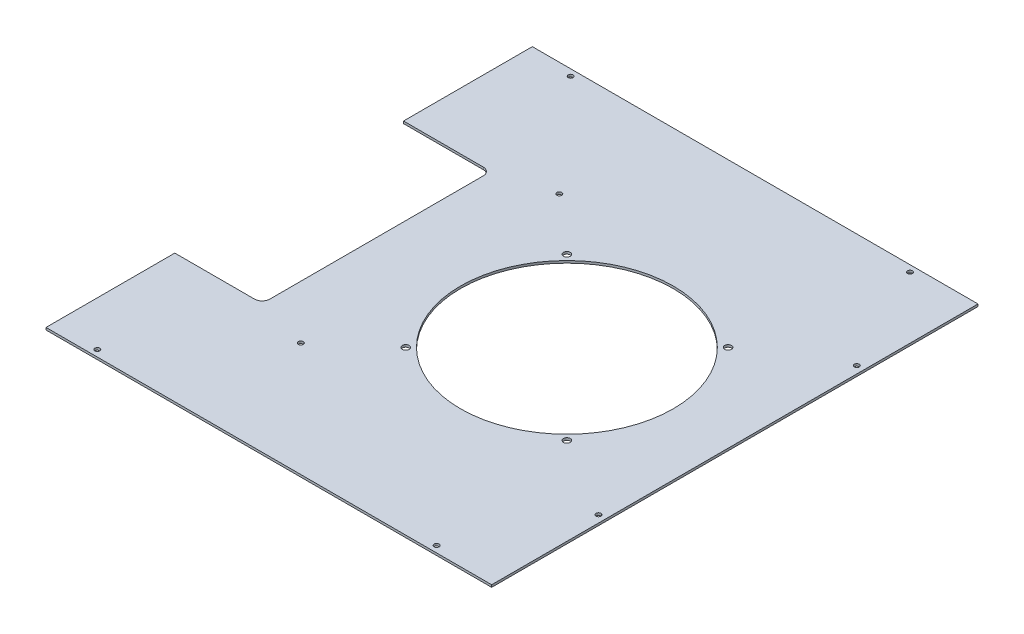
ISO-10303-21;
HEADER;
FILE_DESCRIPTION(('STEP AP214'),'2;1');
FILE_NAME('part.step','',(''),(''),'','','');
FILE_SCHEMA(('AUTOMOTIVE_DESIGN { 1 0 10303 214 1 1 1 1 }'));
ENDSEC;
DATA;
#1=APPLICATION_CONTEXT('core data for automotive mechanical design processes');
#2=APPLICATION_PROTOCOL_DEFINITION('international standard','automotive_design',2000,#1);
#3=PRODUCT_CONTEXT('',#1,'mechanical');
#4=PRODUCT('Part','Part','',(#3));
#5=PRODUCT_RELATED_PRODUCT_CATEGORY('part','',(#4));
#6=PRODUCT_DEFINITION_FORMATION('','',#4);
#7=PRODUCT_DEFINITION_CONTEXT('part definition',#1,'design');
#8=PRODUCT_DEFINITION('design','',#6,#7);
#9=PRODUCT_DEFINITION_SHAPE('','',#8);
#10=(LENGTH_UNIT() NAMED_UNIT(*) SI_UNIT(.MILLI.,.METRE.));
#11=(NAMED_UNIT(*) PLANE_ANGLE_UNIT() SI_UNIT($,.RADIAN.));
#12=(NAMED_UNIT(*) SI_UNIT($,.STERADIAN.) SOLID_ANGLE_UNIT());
#13=UNCERTAINTY_MEASURE_WITH_UNIT(LENGTH_MEASURE(1.E-05),#10,'distance_accuracy_value','');
#14=(GEOMETRIC_REPRESENTATION_CONTEXT(3) GLOBAL_UNCERTAINTY_ASSIGNED_CONTEXT((#13)) GLOBAL_UNIT_ASSIGNED_CONTEXT((#10,
#11,#12)) REPRESENTATION_CONTEXT('',''));
#15=CARTESIAN_POINT('',(0.,0.,0.));
#16=DIRECTION('',(0.,0.,1.));
#17=DIRECTION('',(1.,0.,0.));
#18=AXIS2_PLACEMENT_3D('',#15,#16,#17);
#19=CARTESIAN_POINT('',(0.,3.,0.));
#20=DIRECTION('',(1.,0.,0.));
#21=DIRECTION('',(0.,0.,-1.));
#22=AXIS2_PLACEMENT_3D('',#19,#20,#21);
#23=PLANE('',#22);
#24=DIRECTION('',(0.,0.,1.));
#25=VECTOR('',#24,1.);
#26=CARTESIAN_POINT('',(0.,0.,0.));
#27=LINE('',#26,#25);
#28=CARTESIAN_POINT('',(0.,0.,-640.));
#29=VERTEX_POINT('',#28);
#30=CARTESIAN_POINT('',(0.,0.,-470.5));
#31=VERTEX_POINT('',#30);
#32=EDGE_CURVE('E149',#29,#31,#27,.T.);
#33=ORIENTED_EDGE('',*,*,#32,.T.);
#34=DIRECTION('',(0.,1.,0.));
#35=VECTOR('',#34,1.);
#36=CARTESIAN_POINT('',(0.,0.,-470.5));
#37=LINE('',#36,#35);
#38=CARTESIAN_POINT('',(0.,3.,-470.5));
#39=VERTEX_POINT('',#38);
#40=EDGE_CURVE('E150',#31,#39,#37,.T.);
#41=ORIENTED_EDGE('',*,*,#40,.T.);
#42=DIRECTION('',(0.,0.,1.));
#43=VECTOR('',#42,1.);
#44=CARTESIAN_POINT('',(0.,3.,0.));
#45=LINE('',#44,#43);
#46=CARTESIAN_POINT('',(0.,3.,-640.));
#47=VERTEX_POINT('',#46);
#48=EDGE_CURVE('E179',#47,#39,#45,.T.);
#49=ORIENTED_EDGE('',*,*,#48,.F.);
#50=DIRECTION('',(0.,-1.,0.));
#51=VECTOR('',#50,1.);
#52=CARTESIAN_POINT('',(0.,3.,-640.));
#53=LINE('',#52,#51);
#54=EDGE_CURVE('E163',#47,#29,#53,.T.);
#55=ORIENTED_EDGE('',*,*,#54,.T.);
#56=EDGE_LOOP('',(#33,#41,#49,#55));
#57=FACE_BOUND('',#56,.T.);
#58=ADVANCED_FACE('F43',(#57),#23,.F.);
#59=CARTESIAN_POINT('',(0.,3.,-169.5));
#60=VERTEX_POINT('',#59);
#61=CARTESIAN_POINT('',(0.,3.,0.));
#62=VERTEX_POINT('',#61);
#63=EDGE_CURVE('E95',#60,#62,#45,.T.);
#64=ORIENTED_EDGE('',*,*,#63,.F.);
#65=DIRECTION('',(0.,1.,0.));
#66=VECTOR('',#65,1.);
#67=CARTESIAN_POINT('',(0.,0.,-169.5));
#68=LINE('',#67,#66);
#69=CARTESIAN_POINT('',(0.,0.,-169.5));
#70=VERTEX_POINT('',#69);
#71=EDGE_CURVE('E133',#70,#60,#68,.T.);
#72=ORIENTED_EDGE('',*,*,#71,.F.);
#73=CARTESIAN_POINT('',(0.,0.,0.));
#74=VERTEX_POINT('',#73);
#75=EDGE_CURVE('E141',#70,#74,#27,.T.);
#76=ORIENTED_EDGE('',*,*,#75,.T.);
#77=DIRECTION('',(0.,-1.,0.));
#78=VECTOR('',#77,1.);
#79=CARTESIAN_POINT('',(0.,3.,0.));
#80=LINE('',#79,#78);
#81=EDGE_CURVE('E11',#62,#74,#80,.T.);
#82=ORIENTED_EDGE('',*,*,#81,.F.);
#83=EDGE_LOOP('',(#64,#72,#76,#82));
#84=FACE_BOUND('',#83,.T.);
#85=ADVANCED_FACE('F45',(#84),#23,.F.);
#86=CARTESIAN_POINT('',(0.,3.,0.));
#87=DIRECTION('',(0.,0.,-1.));
#88=DIRECTION('',(-1.,0.,0.));
#89=AXIS2_PLACEMENT_3D('',#86,#87,#88);
#90=PLANE('',#89);
#91=DIRECTION('',(1.,0.,0.));
#92=VECTOR('',#91,1.);
#93=CARTESIAN_POINT('',(0.,0.,0.));
#94=LINE('',#93,#92);
#95=CARTESIAN_POINT('',(586.5,0.,0.));
#96=VERTEX_POINT('',#95);
#97=EDGE_CURVE('E148',#74,#96,#94,.T.);
#98=ORIENTED_EDGE('',*,*,#97,.T.);
#99=DIRECTION('',(0.,-1.,0.));
#100=VECTOR('',#99,1.);
#101=CARTESIAN_POINT('',(586.5,3.,0.));
#102=LINE('',#101,#100);
#103=CARTESIAN_POINT('',(586.5,3.,0.));
#104=VERTEX_POINT('',#103);
#105=EDGE_CURVE('E51',#104,#96,#102,.T.);
#106=ORIENTED_EDGE('',*,*,#105,.F.);
#107=DIRECTION('',(1.,0.,0.));
#108=VECTOR('',#107,1.);
#109=CARTESIAN_POINT('',(0.,3.,0.));
#110=LINE('',#109,#108);
#111=EDGE_CURVE('E181',#62,#104,#110,.T.);
#112=ORIENTED_EDGE('',*,*,#111,.F.);
#113=ORIENTED_EDGE('',*,*,#81,.T.);
#114=EDGE_LOOP('',(#98,#106,#112,#113));
#115=FACE_BOUND('',#114,.T.);
#116=ADVANCED_FACE('F338',(#115),#90,.F.);
#117=CARTESIAN_POINT('',(586.5,3.,0.));
#118=DIRECTION('',(-1.,0.,0.));
#119=DIRECTION('',(0.,0.,1.));
#120=AXIS2_PLACEMENT_3D('',#117,#118,#119);
#121=PLANE('',#120);
#122=DIRECTION('',(0.,0.,-1.));
#123=VECTOR('',#122,1.);
#124=CARTESIAN_POINT('',(586.5,0.,0.));
#125=LINE('',#124,#123);
#126=CARTESIAN_POINT('',(586.5,0.,-640.));
#127=VERTEX_POINT('',#126);
#128=EDGE_CURVE('E160',#96,#127,#125,.T.);
#129=ORIENTED_EDGE('',*,*,#128,.T.);
#130=DIRECTION('',(0.,-1.,0.));
#131=VECTOR('',#130,1.);
#132=CARTESIAN_POINT('',(586.5,3.,-640.));
#133=LINE('',#132,#131);
#134=CARTESIAN_POINT('',(586.5,3.,-640.));
#135=VERTEX_POINT('',#134);
#136=EDGE_CURVE('E165',#135,#127,#133,.T.);
#137=ORIENTED_EDGE('',*,*,#136,.F.);
#138=DIRECTION('',(0.,0.,-1.));
#139=VECTOR('',#138,1.);
#140=CARTESIAN_POINT('',(586.5,3.,0.));
#141=LINE('',#140,#139);
#142=EDGE_CURVE('E172',#104,#135,#141,.T.);
#143=ORIENTED_EDGE('',*,*,#142,.F.);
#144=ORIENTED_EDGE('',*,*,#105,.T.);
#145=EDGE_LOOP('',(#129,#137,#143,#144));
#146=FACE_BOUND('',#145,.T.);
#147=ADVANCED_FACE('F170',(#146),#121,.F.);
#148=CARTESIAN_POINT('',(0.,3.,-640.));
#149=DIRECTION('',(0.,0.,1.));
#150=DIRECTION('',(1.,0.,0.));
#151=AXIS2_PLACEMENT_3D('',#148,#149,#150);
#152=PLANE('',#151);
#153=DIRECTION('',(-1.,0.,0.));
#154=VECTOR('',#153,1.);
#155=CARTESIAN_POINT('',(0.,0.,-640.));
#156=LINE('',#155,#154);
#157=EDGE_CURVE('E88',#127,#29,#156,.T.);
#158=ORIENTED_EDGE('',*,*,#157,.T.);
#159=ORIENTED_EDGE('',*,*,#54,.F.);
#160=DIRECTION('',(-1.,0.,0.));
#161=VECTOR('',#160,1.);
#162=CARTESIAN_POINT('',(0.,3.,-640.));
#163=LINE('',#162,#161);
#164=EDGE_CURVE('E67',#135,#47,#163,.T.);
#165=ORIENTED_EDGE('',*,*,#164,.F.);
#166=ORIENTED_EDGE('',*,*,#136,.T.);
#167=EDGE_LOOP('',(#158,#159,#165,#166));
#168=FACE_BOUND('',#167,.T.);
#169=ADVANCED_FACE('F180',(#168),#152,.F.);
#170=CARTESIAN_POINT('',(0.,3.,0.));
#171=DIRECTION('',(0.,-1.,0.));
#172=DIRECTION('',(0.,0.,-1.));
#173=AXIS2_PLACEMENT_3D('',#170,#171,#172);
#174=PLANE('',#173);
#175=CARTESIAN_POINT('',(505.5,3.,-631.5));
#176=DIRECTION('',(0.,1.,0.));
#177=DIRECTION('',(0.,0.,1.));
#178=AXIS2_PLACEMENT_3D('',#175,#176,#177);
#179=CIRCLE('',#178,3.24999999999994);
#180=CARTESIAN_POINT('',(505.5,3.,-628.25));
#181=VERTEX_POINT('',#180);
#182=EDGE_CURVE('E244',#181,#181,#179,.T.);
#183=ORIENTED_EDGE('',*,*,#182,.F.);
#184=EDGE_LOOP('',(#183));
#185=FACE_BOUND('',#184,.T.);
#186=CARTESIAN_POINT('',(185.5,3.,-490.));
#187=DIRECTION('',(0.,1.,0.));
#188=DIRECTION('',(0.,0.,1.));
#189=AXIS2_PLACEMENT_3D('',#186,#187,#188);
#190=CIRCLE('',#189,3.25000000000001);
#191=CARTESIAN_POINT('',(185.5,3.,-486.75));
#192=VERTEX_POINT('',#191);
#193=EDGE_CURVE('E263',#192,#192,#190,.T.);
#194=ORIENTED_EDGE('',*,*,#193,.F.);
#195=EDGE_LOOP('',(#194));
#196=FACE_BOUND('',#195,.T.);
#197=CARTESIAN_POINT('',(577.,3.,-490.));
#198=DIRECTION('',(0.,1.,0.));
#199=DIRECTION('',(0.,0.,1.));
#200=AXIS2_PLACEMENT_3D('',#197,#198,#199);
#201=CIRCLE('',#200,3.24999999999995);
#202=CARTESIAN_POINT('',(577.,3.,-486.75));
#203=VERTEX_POINT('',#202);
#204=EDGE_CURVE('E257',#203,#203,#201,.T.);
#205=ORIENTED_EDGE('',*,*,#204,.F.);
#206=EDGE_LOOP('',(#205));
#207=FACE_BOUND('',#206,.T.);
#208=CARTESIAN_POINT('',(577.,3.,-150.));
#209=DIRECTION('',(0.,1.,0.));
#210=DIRECTION('',(0.,0.,-1.));
#211=AXIS2_PLACEMENT_3D('',#208,#209,#210);
#212=CIRCLE('',#211,3.24999999999995);
#213=CARTESIAN_POINT('',(577.,3.,-153.25));
#214=VERTEX_POINT('',#213);
#215=EDGE_CURVE('E250',#214,#214,#212,.T.);
#216=ORIENTED_EDGE('',*,*,#215,.F.);
#217=EDGE_LOOP('',(#216));
#218=FACE_BOUND('',#217,.T.);
#219=CARTESIAN_POINT('',(185.5,3.,-150.));
#220=DIRECTION('',(0.,1.,0.));
#221=DIRECTION('',(0.,0.,-1.));
#222=AXIS2_PLACEMENT_3D('',#219,#220,#221);
#223=CIRCLE('',#222,3.25000000000001);
#224=CARTESIAN_POINT('',(185.5,3.,-153.25));
#225=VERTEX_POINT('',#224);
#226=EDGE_CURVE('E251',#225,#225,#223,.T.);
#227=ORIENTED_EDGE('',*,*,#226,.F.);
#228=EDGE_LOOP('',(#227));
#229=FACE_BOUND('',#228,.T.);
#230=CARTESIAN_POINT('',(505.5,3.,-8.49999999999995));
#231=DIRECTION('',(0.,1.,0.));
#232=DIRECTION('',(0.,0.,-1.));
#233=AXIS2_PLACEMENT_3D('',#230,#231,#232);
#234=CIRCLE('',#233,3.24999999999994);
#235=CARTESIAN_POINT('',(505.5,3.,-11.7499999999999));
#236=VERTEX_POINT('',#235);
#237=EDGE_CURVE('E280',#236,#236,#234,.T.);
#238=ORIENTED_EDGE('',*,*,#237,.F.);
#239=EDGE_LOOP('',(#238));
#240=FACE_BOUND('',#239,.T.);
#241=CARTESIAN_POINT('',(59.,3.,-8.49999999999995));
#242=DIRECTION('',(0.,1.,0.));
#243=DIRECTION('',(0.,0.,-1.));
#244=AXIS2_PLACEMENT_3D('',#241,#242,#243);
#245=CIRCLE('',#244,3.24999999999998);
#246=CARTESIAN_POINT('',(59.,3.,-11.7499999999999));
#247=VERTEX_POINT('',#246);
#248=EDGE_CURVE('E274',#247,#247,#245,.T.);
#249=ORIENTED_EDGE('',*,*,#248,.F.);
#250=EDGE_LOOP('',(#249));
#251=FACE_BOUND('',#250,.T.);
#252=CARTESIAN_POINT('',(59.,3.,-631.5));
#253=DIRECTION('',(0.,1.,0.));
#254=DIRECTION('',(0.,0.,1.));
#255=AXIS2_PLACEMENT_3D('',#252,#253,#254);
#256=CIRCLE('',#255,3.24999999999998);
#257=CARTESIAN_POINT('',(59.,3.,-628.25));
#258=VERTEX_POINT('',#257);
#259=EDGE_CURVE('E241',#258,#258,#256,.T.);
#260=ORIENTED_EDGE('',*,*,#259,.F.);
#261=EDGE_LOOP('',(#260));
#262=FACE_BOUND('',#261,.T.);
#263=CARTESIAN_POINT('',(259.433982822018,3.,-213.933982822018));
#264=DIRECTION('',(0.,1.,0.));
#265=DIRECTION('',(0.,0.,1.));
#266=AXIS2_PLACEMENT_3D('',#263,#264,#265);
#267=CIRCLE('',#266,4.50000000000002);
#268=CARTESIAN_POINT('',(259.433982822018,3.,-209.433982822018));
#269=VERTEX_POINT('',#268);
#270=EDGE_CURVE('E226',#269,#269,#267,.T.);
#271=ORIENTED_EDGE('',*,*,#270,.F.);
#272=EDGE_LOOP('',(#271));
#273=FACE_BOUND('',#272,.T.);
#274=CARTESIAN_POINT('',(471.566017177982,3.,-213.933982822018));
#275=DIRECTION('',(0.,1.,0.));
#276=DIRECTION('',(0.,0.,1.));
#277=AXIS2_PLACEMENT_3D('',#274,#275,#276);
#278=CIRCLE('',#277,4.50000000000002);
#279=CARTESIAN_POINT('',(471.566017177982,3.,-209.433982822018));
#280=VERTEX_POINT('',#279);
#281=EDGE_CURVE('E233',#280,#280,#278,.T.);
#282=ORIENTED_EDGE('',*,*,#281,.F.);
#283=EDGE_LOOP('',(#282));
#284=FACE_BOUND('',#283,.T.);
#285=CARTESIAN_POINT('',(471.566017177982,3.,-426.066017177982));
#286=DIRECTION('',(0.,1.,0.));
#287=DIRECTION('',(0.,0.,1.));
#288=AXIS2_PLACEMENT_3D('',#285,#286,#287);
#289=CIRCLE('',#288,4.50000000000009);
#290=CARTESIAN_POINT('',(471.566017177982,3.,-421.566017177982));
#291=VERTEX_POINT('',#290);
#292=EDGE_CURVE('E220',#291,#291,#289,.T.);
#293=ORIENTED_EDGE('',*,*,#292,.F.);
#294=EDGE_LOOP('',(#293));
#295=FACE_BOUND('',#294,.T.);
#296=CARTESIAN_POINT('',(259.433982822018,3.,-426.066017177982));
#297=DIRECTION('',(0.,1.,0.));
#298=DIRECTION('',(0.,0.,1.));
#299=AXIS2_PLACEMENT_3D('',#296,#297,#298);
#300=CIRCLE('',#299,4.50000000000002);
#301=CARTESIAN_POINT('',(259.433982822018,3.,-421.566017177982));
#302=VERTEX_POINT('',#301);
#303=EDGE_CURVE('E217',#302,#302,#300,.T.);
#304=ORIENTED_EDGE('',*,*,#303,.F.);
#305=EDGE_LOOP('',(#304));
#306=FACE_BOUND('',#305,.T.);
#307=CARTESIAN_POINT('',(365.5,3.,-320.));
#308=DIRECTION('',(0.,1.,0.));
#309=DIRECTION('',(0.,0.,1.));
#310=AXIS2_PLACEMENT_3D('',#307,#308,#309);
#311=CIRCLE('',#310,140.);
#312=CARTESIAN_POINT('',(365.5,3.,-180.));
#313=VERTEX_POINT('',#312);
#314=EDGE_CURVE('E211',#313,#313,#311,.T.);
#315=ORIENTED_EDGE('',*,*,#314,.F.);
#316=EDGE_LOOP('',(#315));
#317=FACE_BOUND('',#316,.T.);
#318=ORIENTED_EDGE('',*,*,#48,.T.);
#319=DIRECTION('',(-1.,0.,0.));
#320=VECTOR('',#319,1.);
#321=CARTESIAN_POINT('',(0.,3.,-470.5));
#322=LINE('',#321,#320);
#323=CARTESIAN_POINT('',(105.,3.,-470.5));
#324=VERTEX_POINT('',#323);
#325=EDGE_CURVE('E137',#324,#39,#322,.T.);
#326=ORIENTED_EDGE('',*,*,#325,.F.);
#327=CARTESIAN_POINT('',(105.,3.,-460.5));
#328=DIRECTION('',(0.,1.,0.));
#329=DIRECTION('',(0.,0.,-1.));
#330=AXIS2_PLACEMENT_3D('',#327,#328,#329);
#331=CIRCLE('',#330,10.);
#332=CARTESIAN_POINT('',(115.,3.,-460.5));
#333=VERTEX_POINT('',#332);
#334=EDGE_CURVE('E192',#333,#324,#331,.T.);
#335=ORIENTED_EDGE('',*,*,#334,.F.);
#336=DIRECTION('',(0.,0.,-1.));
#337=VECTOR('',#336,1.);
#338=CARTESIAN_POINT('',(115.,3.,-460.5));
#339=LINE('',#338,#337);
#340=CARTESIAN_POINT('',(115.,3.,-179.5));
#341=VERTEX_POINT('',#340);
#342=EDGE_CURVE('E195',#341,#333,#339,.T.);
#343=ORIENTED_EDGE('',*,*,#342,.F.);
#344=CARTESIAN_POINT('',(105.,3.,-179.5));
#345=DIRECTION('',(0.,1.,0.));
#346=DIRECTION('',(0.,0.,1.));
#347=AXIS2_PLACEMENT_3D('',#344,#345,#346);
#348=CIRCLE('',#347,10.);
#349=CARTESIAN_POINT('',(105.,3.,-169.5));
#350=VERTEX_POINT('',#349);
#351=EDGE_CURVE('E198',#350,#341,#348,.T.);
#352=ORIENTED_EDGE('',*,*,#351,.F.);
#353=DIRECTION('',(1.,0.,0.));
#354=VECTOR('',#353,1.);
#355=CARTESIAN_POINT('',(0.,3.,-169.5));
#356=LINE('',#355,#354);
#357=EDGE_CURVE('E201',#60,#350,#356,.T.);
#358=ORIENTED_EDGE('',*,*,#357,.F.);
#359=ORIENTED_EDGE('',*,*,#63,.T.);
#360=ORIENTED_EDGE('',*,*,#111,.T.);
#361=ORIENTED_EDGE('',*,*,#142,.T.);
#362=ORIENTED_EDGE('',*,*,#164,.T.);
#363=EDGE_LOOP('',(#318,#326,#335,#343,#352,#358,#359,#360,#361,#362));
#364=FACE_BOUND('',#363,.T.);
#365=ADVANCED_FACE('F291',(#185,#196,#207,#218,#229,#240,#251,#262,#273,#284,#295,#306,#317,
#364),#174,.F.);
#366=CARTESIAN_POINT('',(0.,0.,0.));
#367=DIRECTION('',(0.,-1.,0.));
#368=DIRECTION('',(0.,0.,-1.));
#369=AXIS2_PLACEMENT_3D('',#366,#367,#368);
#370=PLANE('',#369);
#371=CARTESIAN_POINT('',(505.5,0.,-631.5));
#372=DIRECTION('',(0.,1.,0.));
#373=DIRECTION('',(0.,0.,1.));
#374=AXIS2_PLACEMENT_3D('',#371,#372,#373);
#375=CIRCLE('',#374,3.24999999999994);
#376=CARTESIAN_POINT('',(505.5,0.,-628.25));
#377=VERTEX_POINT('',#376);
#378=EDGE_CURVE('E266',#377,#377,#375,.T.);
#379=ORIENTED_EDGE('',*,*,#378,.T.);
#380=EDGE_LOOP('',(#379));
#381=FACE_BOUND('',#380,.T.);
#382=CARTESIAN_POINT('',(185.5,0.,-490.));
#383=DIRECTION('',(0.,1.,0.));
#384=DIRECTION('',(0.,0.,1.));
#385=AXIS2_PLACEMENT_3D('',#382,#383,#384);
#386=CIRCLE('',#385,3.25000000000001);
#387=CARTESIAN_POINT('',(185.5,0.,-486.75));
#388=VERTEX_POINT('',#387);
#389=EDGE_CURVE('E260',#388,#388,#386,.T.);
#390=ORIENTED_EDGE('',*,*,#389,.T.);
#391=EDGE_LOOP('',(#390));
#392=FACE_BOUND('',#391,.T.);
#393=CARTESIAN_POINT('',(577.,0.,-490.));
#394=DIRECTION('',(0.,1.,0.));
#395=DIRECTION('',(0.,0.,1.));
#396=AXIS2_PLACEMENT_3D('',#393,#394,#395);
#397=CIRCLE('',#396,3.24999999999995);
#398=CARTESIAN_POINT('',(577.,0.,-486.75));
#399=VERTEX_POINT('',#398);
#400=EDGE_CURVE('E254',#399,#399,#397,.T.);
#401=ORIENTED_EDGE('',*,*,#400,.T.);
#402=EDGE_LOOP('',(#401));
#403=FACE_BOUND('',#402,.T.);
#404=CARTESIAN_POINT('',(577.,0.,-150.));
#405=DIRECTION('',(0.,1.,0.));
#406=DIRECTION('',(0.,0.,-1.));
#407=AXIS2_PLACEMENT_3D('',#404,#405,#406);
#408=CIRCLE('',#407,3.24999999999995);
#409=CARTESIAN_POINT('',(577.,0.,-153.25));
#410=VERTEX_POINT('',#409);
#411=EDGE_CURVE('E247',#410,#410,#408,.T.);
#412=ORIENTED_EDGE('',*,*,#411,.T.);
#413=EDGE_LOOP('',(#412));
#414=FACE_BOUND('',#413,.T.);
#415=CARTESIAN_POINT('',(185.5,0.,-150.));
#416=DIRECTION('',(0.,1.,0.));
#417=DIRECTION('',(0.,0.,-1.));
#418=AXIS2_PLACEMENT_3D('',#415,#416,#417);
#419=CIRCLE('',#418,3.25000000000001);
#420=CARTESIAN_POINT('',(185.5,0.,-153.25));
#421=VERTEX_POINT('',#420);
#422=EDGE_CURVE('E283',#421,#421,#419,.T.);
#423=ORIENTED_EDGE('',*,*,#422,.T.);
#424=EDGE_LOOP('',(#423));
#425=FACE_BOUND('',#424,.T.);
#426=CARTESIAN_POINT('',(505.5,0.,-8.49999999999995));
#427=DIRECTION('',(0.,1.,0.));
#428=DIRECTION('',(0.,0.,-1.));
#429=AXIS2_PLACEMENT_3D('',#426,#427,#428);
#430=CIRCLE('',#429,3.24999999999994);
#431=CARTESIAN_POINT('',(505.5,0.,-11.7499999999999));
#432=VERTEX_POINT('',#431);
#433=EDGE_CURVE('E277',#432,#432,#430,.T.);
#434=ORIENTED_EDGE('',*,*,#433,.T.);
#435=EDGE_LOOP('',(#434));
#436=FACE_BOUND('',#435,.T.);
#437=CARTESIAN_POINT('',(59.,0.,-8.49999999999995));
#438=DIRECTION('',(0.,1.,0.));
#439=DIRECTION('',(0.,0.,-1.));
#440=AXIS2_PLACEMENT_3D('',#437,#438,#439);
#441=CIRCLE('',#440,3.24999999999998);
#442=CARTESIAN_POINT('',(59.,0.,-11.7499999999999));
#443=VERTEX_POINT('',#442);
#444=EDGE_CURVE('E271',#443,#443,#441,.T.);
#445=ORIENTED_EDGE('',*,*,#444,.T.);
#446=EDGE_LOOP('',(#445));
#447=FACE_BOUND('',#446,.T.);
#448=CARTESIAN_POINT('',(59.,0.,-631.5));
#449=DIRECTION('',(0.,1.,0.));
#450=DIRECTION('',(0.,0.,1.));
#451=AXIS2_PLACEMENT_3D('',#448,#449,#450);
#452=CIRCLE('',#451,3.24999999999998);
#453=CARTESIAN_POINT('',(59.,0.,-628.25));
#454=VERTEX_POINT('',#453);
#455=EDGE_CURVE('E227',#454,#454,#452,.T.);
#456=ORIENTED_EDGE('',*,*,#455,.T.);
#457=EDGE_LOOP('',(#456));
#458=FACE_BOUND('',#457,.T.);
#459=CARTESIAN_POINT('',(259.433982822018,0.,-213.933982822018));
#460=DIRECTION('',(0.,1.,0.));
#461=DIRECTION('',(0.,0.,1.));
#462=AXIS2_PLACEMENT_3D('',#459,#460,#461);
#463=CIRCLE('',#462,4.50000000000002);
#464=CARTESIAN_POINT('',(259.433982822018,0.,-209.433982822018));
#465=VERTEX_POINT('',#464);
#466=EDGE_CURVE('E223',#465,#465,#463,.T.);
#467=ORIENTED_EDGE('',*,*,#466,.T.);
#468=EDGE_LOOP('',(#467));
#469=FACE_BOUND('',#468,.T.);
#470=CARTESIAN_POINT('',(471.566017177982,0.,-213.933982822018));
#471=DIRECTION('',(0.,1.,0.));
#472=DIRECTION('',(0.,0.,1.));
#473=AXIS2_PLACEMENT_3D('',#470,#471,#472);
#474=CIRCLE('',#473,4.50000000000002);
#475=CARTESIAN_POINT('',(471.566017177982,0.,-209.433982822018));
#476=VERTEX_POINT('',#475);
#477=EDGE_CURVE('E230',#476,#476,#474,.T.);
#478=ORIENTED_EDGE('',*,*,#477,.T.);
#479=EDGE_LOOP('',(#478));
#480=FACE_BOUND('',#479,.T.);
#481=CARTESIAN_POINT('',(471.566017177982,0.,-426.066017177982));
#482=DIRECTION('',(0.,1.,0.));
#483=DIRECTION('',(0.,0.,1.));
#484=AXIS2_PLACEMENT_3D('',#481,#482,#483);
#485=CIRCLE('',#484,4.50000000000009);
#486=CARTESIAN_POINT('',(471.566017177982,0.,-421.566017177982));
#487=VERTEX_POINT('',#486);
#488=EDGE_CURVE('E236',#487,#487,#485,.T.);
#489=ORIENTED_EDGE('',*,*,#488,.T.);
#490=EDGE_LOOP('',(#489));
#491=FACE_BOUND('',#490,.T.);
#492=CARTESIAN_POINT('',(259.433982822018,0.,-426.066017177982));
#493=DIRECTION('',(0.,1.,0.));
#494=DIRECTION('',(0.,0.,1.));
#495=AXIS2_PLACEMENT_3D('',#492,#493,#494);
#496=CIRCLE('',#495,4.50000000000002);
#497=CARTESIAN_POINT('',(259.433982822018,0.,-421.566017177982));
#498=VERTEX_POINT('',#497);
#499=EDGE_CURVE('E214',#498,#498,#496,.T.);
#500=ORIENTED_EDGE('',*,*,#499,.T.);
#501=EDGE_LOOP('',(#500));
#502=FACE_BOUND('',#501,.T.);
#503=CARTESIAN_POINT('',(365.5,0.,-320.));
#504=DIRECTION('',(0.,1.,0.));
#505=DIRECTION('',(0.,0.,1.));
#506=AXIS2_PLACEMENT_3D('',#503,#504,#505);
#507=CIRCLE('',#506,140.);
#508=CARTESIAN_POINT('',(365.5,0.,-180.));
#509=VERTEX_POINT('',#508);
#510=EDGE_CURVE('E203',#509,#509,#507,.T.);
#511=ORIENTED_EDGE('',*,*,#510,.T.);
#512=EDGE_LOOP('',(#511));
#513=FACE_BOUND('',#512,.T.);
#514=DIRECTION('',(-1.,0.,0.));
#515=VECTOR('',#514,1.);
#516=CARTESIAN_POINT('',(0.,0.,-470.5));
#517=LINE('',#516,#515);
#518=CARTESIAN_POINT('',(105.,0.,-470.5));
#519=VERTEX_POINT('',#518);
#520=EDGE_CURVE('E143',#519,#31,#517,.T.);
#521=ORIENTED_EDGE('',*,*,#520,.T.);
#522=ORIENTED_EDGE('',*,*,#32,.F.);
#523=ORIENTED_EDGE('',*,*,#157,.F.);
#524=ORIENTED_EDGE('',*,*,#128,.F.);
#525=ORIENTED_EDGE('',*,*,#97,.F.);
#526=ORIENTED_EDGE('',*,*,#75,.F.);
#527=DIRECTION('',(1.,0.,0.));
#528=VECTOR('',#527,1.);
#529=CARTESIAN_POINT('',(0.,0.,-169.5));
#530=LINE('',#529,#528);
#531=CARTESIAN_POINT('',(105.,0.,-169.5));
#532=VERTEX_POINT('',#531);
#533=EDGE_CURVE('E129',#70,#532,#530,.T.);
#534=ORIENTED_EDGE('',*,*,#533,.T.);
#535=CARTESIAN_POINT('',(105.,0.,-179.5));
#536=DIRECTION('',(0.,1.,0.));
#537=DIRECTION('',(0.,0.,1.));
#538=AXIS2_PLACEMENT_3D('',#535,#536,#537);
#539=CIRCLE('',#538,10.);
#540=CARTESIAN_POINT('',(115.,0.,-179.5));
#541=VERTEX_POINT('',#540);
#542=EDGE_CURVE('E58',#532,#541,#539,.T.);
#543=ORIENTED_EDGE('',*,*,#542,.T.);
#544=DIRECTION('',(0.,0.,-1.));
#545=VECTOR('',#544,1.);
#546=CARTESIAN_POINT('',(115.,0.,-460.5));
#547=LINE('',#546,#545);
#548=CARTESIAN_POINT('',(115.,0.,-460.5));
#549=VERTEX_POINT('',#548);
#550=EDGE_CURVE('E207',#541,#549,#547,.T.);
#551=ORIENTED_EDGE('',*,*,#550,.T.);
#552=CARTESIAN_POINT('',(105.,0.,-460.5));
#553=DIRECTION('',(0.,1.,0.));
#554=DIRECTION('',(0.,0.,-1.));
#555=AXIS2_PLACEMENT_3D('',#552,#553,#554);
#556=CIRCLE('',#555,10.);
#557=EDGE_CURVE('E205',#549,#519,#556,.T.);
#558=ORIENTED_EDGE('',*,*,#557,.T.);
#559=EDGE_LOOP('',(#521,#522,#523,#524,#525,#526,#534,#543,#551,#558));
#560=FACE_BOUND('',#559,.T.);
#561=ADVANCED_FACE('F146',(#381,#392,#403,#414,#425,#436,#447,#458,#469,#480,#491,#502,#513,
#560),#370,.T.);
#562=CARTESIAN_POINT('',(0.,0.,-470.5));
#563=DIRECTION('',(0.,0.,-1.));
#564=DIRECTION('',(-1.,0.,0.));
#565=AXIS2_PLACEMENT_3D('',#562,#563,#564);
#566=PLANE('',#565);
#567=ORIENTED_EDGE('',*,*,#325,.T.);
#568=ORIENTED_EDGE('',*,*,#40,.F.);
#569=ORIENTED_EDGE('',*,*,#520,.F.);
#570=DIRECTION('',(0.,1.,0.));
#571=VECTOR('',#570,1.);
#572=CARTESIAN_POINT('',(105.,0.,-470.5));
#573=LINE('',#572,#571);
#574=EDGE_CURVE('E154',#519,#324,#573,.T.);
#575=ORIENTED_EDGE('',*,*,#574,.T.);
#576=EDGE_LOOP('',(#567,#568,#569,#575));
#577=FACE_BOUND('',#576,.T.);
#578=ADVANCED_FACE('F315',(#577),#566,.F.);
#579=CARTESIAN_POINT('',(105.,0.,-460.5));
#580=DIRECTION('',(0.,1.,0.));
#581=DIRECTION('',(0.,0.,1.));
#582=AXIS2_PLACEMENT_3D('',#579,#580,#581);
#583=CYLINDRICAL_SURFACE('',#582,10.);
#584=ORIENTED_EDGE('',*,*,#334,.T.);
#585=ORIENTED_EDGE('',*,*,#574,.F.);
#586=ORIENTED_EDGE('',*,*,#557,.F.);
#587=DIRECTION('',(0.,1.,0.));
#588=VECTOR('',#587,1.);
#589=CARTESIAN_POINT('',(115.,0.,-460.5));
#590=LINE('',#589,#588);
#591=EDGE_CURVE('E188',#549,#333,#590,.T.);
#592=ORIENTED_EDGE('',*,*,#591,.T.);
#593=EDGE_LOOP('',(#584,#585,#586,#592));
#594=FACE_BOUND('',#593,.T.);
#595=ADVANCED_FACE('F318',(#594),#583,.F.);
#596=CARTESIAN_POINT('',(115.,0.,-460.5));
#597=DIRECTION('',(1.,0.,0.));
#598=DIRECTION('',(0.,0.,-1.));
#599=AXIS2_PLACEMENT_3D('',#596,#597,#598);
#600=PLANE('',#599);
#601=ORIENTED_EDGE('',*,*,#342,.T.);
#602=ORIENTED_EDGE('',*,*,#591,.F.);
#603=ORIENTED_EDGE('',*,*,#550,.F.);
#604=DIRECTION('',(0.,1.,0.));
#605=VECTOR('',#604,1.);
#606=CARTESIAN_POINT('',(115.,0.,-179.5));
#607=LINE('',#606,#605);
#608=EDGE_CURVE('E186',#541,#341,#607,.T.);
#609=ORIENTED_EDGE('',*,*,#608,.T.);
#610=EDGE_LOOP('',(#601,#602,#603,#609));
#611=FACE_BOUND('',#610,.T.);
#612=ADVANCED_FACE('F321',(#611),#600,.F.);
#613=CARTESIAN_POINT('',(105.,0.,-179.5));
#614=DIRECTION('',(0.,1.,0.));
#615=DIRECTION('',(0.,0.,1.));
#616=AXIS2_PLACEMENT_3D('',#613,#614,#615);
#617=CYLINDRICAL_SURFACE('',#616,10.);
#618=ORIENTED_EDGE('',*,*,#351,.T.);
#619=ORIENTED_EDGE('',*,*,#608,.F.);
#620=ORIENTED_EDGE('',*,*,#542,.F.);
#621=DIRECTION('',(0.,1.,0.));
#622=VECTOR('',#621,1.);
#623=CARTESIAN_POINT('',(105.,0.,-169.5));
#624=LINE('',#623,#622);
#625=EDGE_CURVE('E134',#532,#350,#624,.T.);
#626=ORIENTED_EDGE('',*,*,#625,.T.);
#627=EDGE_LOOP('',(#618,#619,#620,#626));
#628=FACE_BOUND('',#627,.T.);
#629=ADVANCED_FACE('F323',(#628),#617,.F.);
#630=CARTESIAN_POINT('',(0.,0.,-169.5));
#631=DIRECTION('',(0.,0.,1.));
#632=DIRECTION('',(1.,0.,0.));
#633=AXIS2_PLACEMENT_3D('',#630,#631,#632);
#634=PLANE('',#633);
#635=ORIENTED_EDGE('',*,*,#357,.T.);
#636=ORIENTED_EDGE('',*,*,#625,.F.);
#637=ORIENTED_EDGE('',*,*,#533,.F.);
#638=ORIENTED_EDGE('',*,*,#71,.T.);
#639=EDGE_LOOP('',(#635,#636,#637,#638));
#640=FACE_BOUND('',#639,.T.);
#641=ADVANCED_FACE('F132',(#640),#634,.F.);
#642=CARTESIAN_POINT('',(365.5,0.,-320.));
#643=DIRECTION('',(0.,1.,0.));
#644=DIRECTION('',(0.,0.,1.));
#645=AXIS2_PLACEMENT_3D('',#642,#643,#644);
#646=CYLINDRICAL_SURFACE('',#645,140.);
#647=ORIENTED_EDGE('',*,*,#510,.F.);
#648=EDGE_LOOP('',(#647));
#649=FACE_BOUND('',#648,.T.);
#650=ORIENTED_EDGE('',*,*,#314,.T.);
#651=EDGE_LOOP('',(#650));
#652=FACE_BOUND('',#651,.T.);
#653=ADVANCED_FACE('F330',(#649,#652),#646,.F.);
#654=CARTESIAN_POINT('',(259.433982822018,0.,-426.066017177982));
#655=DIRECTION('',(0.,1.,0.));
#656=DIRECTION('',(0.,0.,1.));
#657=AXIS2_PLACEMENT_3D('',#654,#655,#656);
#658=CYLINDRICAL_SURFACE('',#657,4.50000000000002);
#659=ORIENTED_EDGE('',*,*,#499,.F.);
#660=EDGE_LOOP('',(#659));
#661=FACE_BOUND('',#660,.T.);
#662=ORIENTED_EDGE('',*,*,#303,.T.);
#663=EDGE_LOOP('',(#662));
#664=FACE_BOUND('',#663,.T.);
#665=ADVANCED_FACE('F383',(#661,#664),#658,.F.);
#666=CARTESIAN_POINT('',(471.566017177982,0.,-426.066017177982));
#667=DIRECTION('',(0.,1.,0.));
#668=DIRECTION('',(0.,0.,1.));
#669=AXIS2_PLACEMENT_3D('',#666,#667,#668);
#670=CYLINDRICAL_SURFACE('',#669,4.50000000000009);
#671=ORIENTED_EDGE('',*,*,#488,.F.);
#672=EDGE_LOOP('',(#671));
#673=FACE_BOUND('',#672,.T.);
#674=ORIENTED_EDGE('',*,*,#292,.T.);
#675=EDGE_LOOP('',(#674));
#676=FACE_BOUND('',#675,.T.);
#677=ADVANCED_FACE('F388',(#673,#676),#670,.F.);
#678=CARTESIAN_POINT('',(471.566017177982,0.,-213.933982822018));
#679=DIRECTION('',(0.,1.,0.));
#680=DIRECTION('',(0.,0.,1.));
#681=AXIS2_PLACEMENT_3D('',#678,#679,#680);
#682=CYLINDRICAL_SURFACE('',#681,4.50000000000002);
#683=ORIENTED_EDGE('',*,*,#477,.F.);
#684=EDGE_LOOP('',(#683));
#685=FACE_BOUND('',#684,.T.);
#686=ORIENTED_EDGE('',*,*,#281,.T.);
#687=EDGE_LOOP('',(#686));
#688=FACE_BOUND('',#687,.T.);
#689=ADVANCED_FACE('F433',(#685,#688),#682,.F.);
#690=CARTESIAN_POINT('',(259.433982822018,0.,-213.933982822018));
#691=DIRECTION('',(0.,1.,0.));
#692=DIRECTION('',(0.,0.,1.));
#693=AXIS2_PLACEMENT_3D('',#690,#691,#692);
#694=CYLINDRICAL_SURFACE('',#693,4.50000000000002);
#695=ORIENTED_EDGE('',*,*,#466,.F.);
#696=EDGE_LOOP('',(#695));
#697=FACE_BOUND('',#696,.T.);
#698=ORIENTED_EDGE('',*,*,#270,.T.);
#699=EDGE_LOOP('',(#698));
#700=FACE_BOUND('',#699,.T.);
#701=ADVANCED_FACE('F443',(#697,#700),#694,.F.);
#702=CARTESIAN_POINT('',(59.,0.,-631.5));
#703=DIRECTION('',(0.,1.,0.));
#704=DIRECTION('',(0.,0.,1.));
#705=AXIS2_PLACEMENT_3D('',#702,#703,#704);
#706=CYLINDRICAL_SURFACE('',#705,3.24999999999998);
#707=ORIENTED_EDGE('',*,*,#455,.F.);
#708=EDGE_LOOP('',(#707));
#709=FACE_BOUND('',#708,.T.);
#710=ORIENTED_EDGE('',*,*,#259,.T.);
#711=EDGE_LOOP('',(#710));
#712=FACE_BOUND('',#711,.T.);
#713=ADVANCED_FACE('F453',(#709,#712),#706,.F.);
#714=CARTESIAN_POINT('',(59.,0.,-8.49999999999995));
#715=DIRECTION('',(0.,1.,0.));
#716=DIRECTION('',(0.,0.,1.));
#717=AXIS2_PLACEMENT_3D('',#714,#715,#716);
#718=CYLINDRICAL_SURFACE('',#717,3.24999999999998);
#719=ORIENTED_EDGE('',*,*,#444,.F.);
#720=EDGE_LOOP('',(#719));
#721=FACE_BOUND('',#720,.T.);
#722=ORIENTED_EDGE('',*,*,#248,.T.);
#723=EDGE_LOOP('',(#722));
#724=FACE_BOUND('',#723,.T.);
#725=ADVANCED_FACE('F461',(#721,#724),#718,.F.);
#726=CARTESIAN_POINT('',(505.5,0.,-8.49999999999995));
#727=DIRECTION('',(0.,1.,0.));
#728=DIRECTION('',(0.,0.,1.));
#729=AXIS2_PLACEMENT_3D('',#726,#727,#728);
#730=CYLINDRICAL_SURFACE('',#729,3.24999999999994);
#731=ORIENTED_EDGE('',*,*,#433,.F.);
#732=EDGE_LOOP('',(#731));
#733=FACE_BOUND('',#732,.T.);
#734=ORIENTED_EDGE('',*,*,#237,.T.);
#735=EDGE_LOOP('',(#734));
#736=FACE_BOUND('',#735,.T.);
#737=ADVANCED_FACE('F471',(#733,#736),#730,.F.);
#738=CARTESIAN_POINT('',(185.5,0.,-150.));
#739=DIRECTION('',(0.,1.,0.));
#740=DIRECTION('',(0.,0.,1.));
#741=AXIS2_PLACEMENT_3D('',#738,#739,#740);
#742=CYLINDRICAL_SURFACE('',#741,3.25000000000001);
#743=ORIENTED_EDGE('',*,*,#422,.F.);
#744=EDGE_LOOP('',(#743));
#745=FACE_BOUND('',#744,.T.);
#746=ORIENTED_EDGE('',*,*,#226,.T.);
#747=EDGE_LOOP('',(#746));
#748=FACE_BOUND('',#747,.T.);
#749=ADVANCED_FACE('F289',(#745,#748),#742,.F.);
#750=CARTESIAN_POINT('',(577.,0.,-150.));
#751=DIRECTION('',(0.,1.,0.));
#752=DIRECTION('',(0.,0.,1.));
#753=AXIS2_PLACEMENT_3D('',#750,#751,#752);
#754=CYLINDRICAL_SURFACE('',#753,3.24999999999995);
#755=ORIENTED_EDGE('',*,*,#411,.F.);
#756=EDGE_LOOP('',(#755));
#757=FACE_BOUND('',#756,.T.);
#758=ORIENTED_EDGE('',*,*,#215,.T.);
#759=EDGE_LOOP('',(#758));
#760=FACE_BOUND('',#759,.T.);
#761=ADVANCED_FACE('F490',(#757,#760),#754,.F.);
#762=CARTESIAN_POINT('',(577.,0.,-490.));
#763=DIRECTION('',(0.,1.,0.));
#764=DIRECTION('',(0.,0.,1.));
#765=AXIS2_PLACEMENT_3D('',#762,#763,#764);
#766=CYLINDRICAL_SURFACE('',#765,3.24999999999995);
#767=ORIENTED_EDGE('',*,*,#400,.F.);
#768=EDGE_LOOP('',(#767));
#769=FACE_BOUND('',#768,.T.);
#770=ORIENTED_EDGE('',*,*,#204,.T.);
#771=EDGE_LOOP('',(#770));
#772=FACE_BOUND('',#771,.T.);
#773=ADVANCED_FACE('F500',(#769,#772),#766,.F.);
#774=CARTESIAN_POINT('',(185.5,0.,-490.));
#775=DIRECTION('',(0.,1.,0.));
#776=DIRECTION('',(0.,0.,1.));
#777=AXIS2_PLACEMENT_3D('',#774,#775,#776);
#778=CYLINDRICAL_SURFACE('',#777,3.25000000000001);
#779=ORIENTED_EDGE('',*,*,#389,.F.);
#780=EDGE_LOOP('',(#779));
#781=FACE_BOUND('',#780,.T.);
#782=ORIENTED_EDGE('',*,*,#193,.T.);
#783=EDGE_LOOP('',(#782));
#784=FACE_BOUND('',#783,.T.);
#785=ADVANCED_FACE('F510',(#781,#784),#778,.F.);
#786=CARTESIAN_POINT('',(505.5,0.,-631.5));
#787=DIRECTION('',(0.,1.,0.));
#788=DIRECTION('',(0.,0.,1.));
#789=AXIS2_PLACEMENT_3D('',#786,#787,#788);
#790=CYLINDRICAL_SURFACE('',#789,3.24999999999994);
#791=ORIENTED_EDGE('',*,*,#378,.F.);
#792=EDGE_LOOP('',(#791));
#793=FACE_BOUND('',#792,.T.);
#794=ORIENTED_EDGE('',*,*,#182,.T.);
#795=EDGE_LOOP('',(#794));
#796=FACE_BOUND('',#795,.T.);
#797=ADVANCED_FACE('F520',(#793,#796),#790,.F.);
#798=CLOSED_SHELL('',(#58,#85,#116,#147,#169,#365,#561,#578,#595,#612,#629,#641,#653,#665,#677,
#689,#701,#713,#725,#737,#749,#761,#773,#785,#797));
#799=MANIFOLD_SOLID_BREP('B2',#798);
#800=ADVANCED_BREP_SHAPE_REPRESENTATION('',(#18,#799),#14);
#801=SHAPE_DEFINITION_REPRESENTATION(#9,#800);
ENDSEC;
END-ISO-10303-21;
